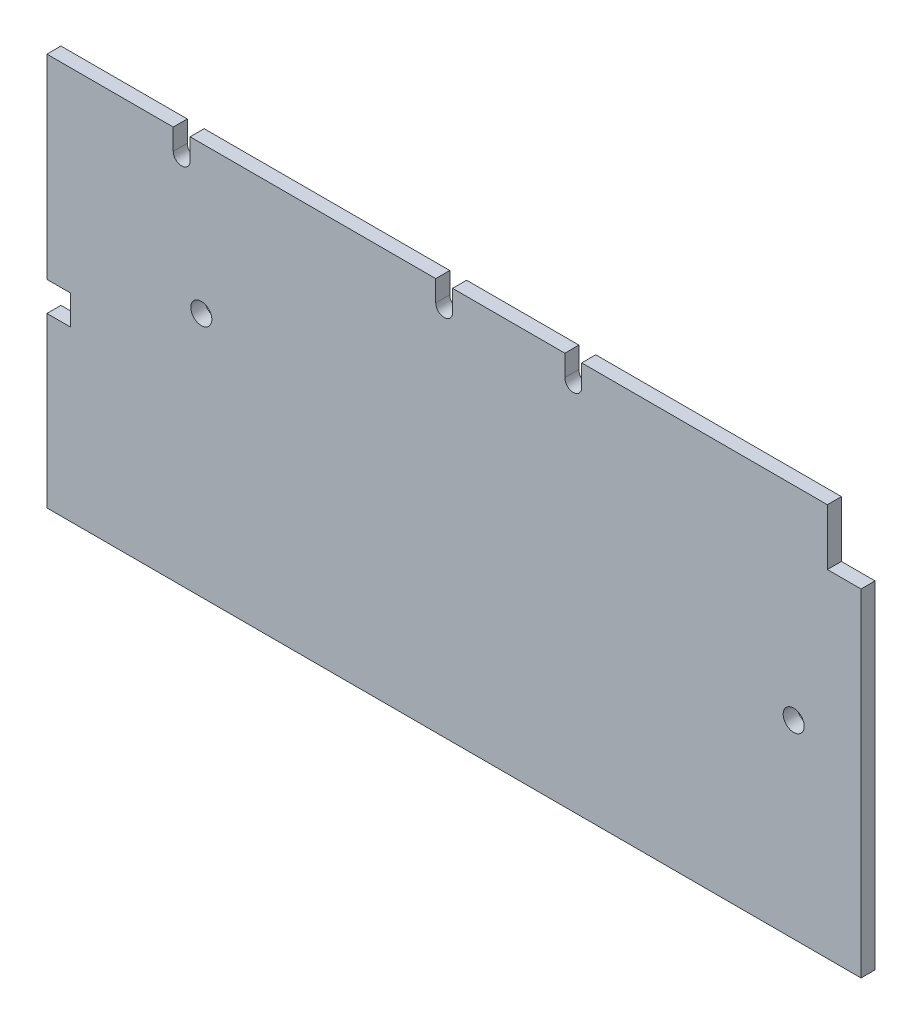
ISO-10303-21;
HEADER;
FILE_DESCRIPTION(('STEP AP214'),'2;1');
FILE_NAME('part.step','',(''),(''),'','','');
FILE_SCHEMA(('AUTOMOTIVE_DESIGN { 1 0 10303 214 1 1 1 1 }'));
ENDSEC;
DATA;
#1=APPLICATION_CONTEXT('core data for automotive mechanical design processes');
#2=APPLICATION_PROTOCOL_DEFINITION('international standard','automotive_design',2000,#1);
#3=PRODUCT_CONTEXT('',#1,'mechanical');
#4=PRODUCT('Part','Part','',(#3));
#5=PRODUCT_RELATED_PRODUCT_CATEGORY('part','',(#4));
#6=PRODUCT_DEFINITION_FORMATION('','',#4);
#7=PRODUCT_DEFINITION_CONTEXT('part definition',#1,'design');
#8=PRODUCT_DEFINITION('design','',#6,#7);
#9=PRODUCT_DEFINITION_SHAPE('','',#8);
#10=(LENGTH_UNIT() NAMED_UNIT(*) SI_UNIT(.MILLI.,.METRE.));
#11=(NAMED_UNIT(*) PLANE_ANGLE_UNIT() SI_UNIT($,.RADIAN.));
#12=(NAMED_UNIT(*) SI_UNIT($,.STERADIAN.) SOLID_ANGLE_UNIT());
#13=UNCERTAINTY_MEASURE_WITH_UNIT(LENGTH_MEASURE(1.E-05),#10,'distance_accuracy_value','');
#14=(GEOMETRIC_REPRESENTATION_CONTEXT(3) GLOBAL_UNCERTAINTY_ASSIGNED_CONTEXT((#13)) GLOBAL_UNIT_ASSIGNED_CONTEXT((#10,
#11,#12)) REPRESENTATION_CONTEXT('',''));
#15=CARTESIAN_POINT('',(0.,0.,0.));
#16=DIRECTION('',(0.,0.,1.));
#17=DIRECTION('',(1.,0.,0.));
#18=AXIS2_PLACEMENT_3D('',#15,#16,#17);
#19=CARTESIAN_POINT('',(14.9531265114608,11.8875176810802,1.));
#20=DIRECTION('',(0.,0.,-1.));
#21=DIRECTION('',(-1.,0.,0.));
#22=AXIS2_PLACEMENT_3D('',#19,#20,#21);
#23=CYLINDRICAL_SURFACE('',#22,0.600461971771314);
#24=CARTESIAN_POINT('',(14.9531265114608,11.8875176810802,0.));
#25=DIRECTION('',(0.,0.,1.));
#26=DIRECTION('',(1.,0.,0.));
#27=AXIS2_PLACEMENT_3D('',#24,#25,#26);
#28=CIRCLE('',#27,0.600461971771314);
#29=CARTESIAN_POINT('',(14.3531265114608,11.9110671936759,0.));
#30=VERTEX_POINT('',#29);
#31=CARTESIAN_POINT('',(15.5531265114608,11.9110671936759,0.));
#32=VERTEX_POINT('',#31);
#33=EDGE_CURVE('E270',#30,#32,#28,.T.);
#34=ORIENTED_EDGE('',*,*,#33,.F.);
#35=DIRECTION('',(0.,0.,-1.));
#36=VECTOR('',#35,1.);
#37=CARTESIAN_POINT('',(14.3531265114608,11.9110671936759,1.));
#38=LINE('',#37,#36);
#39=CARTESIAN_POINT('',(14.3531265114608,11.9110671936759,1.));
#40=VERTEX_POINT('',#39);
#41=EDGE_CURVE('E11',#40,#30,#38,.T.);
#42=ORIENTED_EDGE('',*,*,#41,.F.);
#43=CARTESIAN_POINT('',(14.9531265114608,11.8875176810802,1.));
#44=DIRECTION('',(0.,0.,1.));
#45=DIRECTION('',(1.,0.,0.));
#46=AXIS2_PLACEMENT_3D('',#43,#44,#45);
#47=CIRCLE('',#46,0.600461971771314);
#48=CARTESIAN_POINT('',(15.5531265114608,11.9110671936759,1.));
#49=VERTEX_POINT('',#48);
#50=EDGE_CURVE('E227',#40,#49,#47,.T.);
#51=ORIENTED_EDGE('',*,*,#50,.T.);
#52=DIRECTION('',(0.,0.,-1.));
#53=VECTOR('',#52,1.);
#54=CARTESIAN_POINT('',(15.5531265114608,11.9110671936759,1.));
#55=LINE('',#54,#53);
#56=EDGE_CURVE('E129',#49,#32,#55,.T.);
#57=ORIENTED_EDGE('',*,*,#56,.T.);
#58=EDGE_LOOP('',(#34,#42,#51,#57));
#59=FACE_BOUND('',#58,.T.);
#60=ADVANCED_FACE('F36',(#59),#23,.F.);
#61=CARTESIAN_POINT('',(14.3531265114608,0.,1.));
#62=DIRECTION('',(1.,0.,0.));
#63=DIRECTION('',(0.,0.,-1.));
#64=AXIS2_PLACEMENT_3D('',#61,#62,#63);
#65=PLANE('',#64);
#66=DIRECTION('',(0.,-1.,0.));
#67=VECTOR('',#66,1.);
#68=CARTESIAN_POINT('',(14.3531265114608,0.,0.));
#69=LINE('',#68,#67);
#70=CARTESIAN_POINT('',(14.3531265114608,13.4110671936759,0.));
#71=VERTEX_POINT('',#70);
#72=EDGE_CURVE('E273',#71,#30,#69,.T.);
#73=ORIENTED_EDGE('',*,*,#72,.F.);
#74=DIRECTION('',(0.,0.,-1.));
#75=VECTOR('',#74,1.);
#76=CARTESIAN_POINT('',(14.3531265114608,13.4110671936759,1.));
#77=LINE('',#76,#75);
#78=CARTESIAN_POINT('',(14.3531265114608,13.4110671936759,1.));
#79=VERTEX_POINT('',#78);
#80=EDGE_CURVE('E45',#79,#71,#77,.T.);
#81=ORIENTED_EDGE('',*,*,#80,.F.);
#82=DIRECTION('',(0.,-1.,0.));
#83=VECTOR('',#82,1.);
#84=CARTESIAN_POINT('',(14.3531265114608,0.,1.));
#85=LINE('',#84,#83);
#86=EDGE_CURVE('E222',#79,#40,#85,.T.);
#87=ORIENTED_EDGE('',*,*,#86,.T.);
#88=ORIENTED_EDGE('',*,*,#41,.T.);
#89=EDGE_LOOP('',(#73,#81,#87,#88));
#90=FACE_BOUND('',#89,.T.);
#91=ADVANCED_FACE('F370',(#90),#65,.T.);
#92=CARTESIAN_POINT('',(0.,13.4110671936759,1.));
#93=DIRECTION('',(0.,1.,0.));
#94=DIRECTION('',(0.,0.,1.));
#95=AXIS2_PLACEMENT_3D('',#92,#93,#94);
#96=PLANE('',#95);
#97=DIRECTION('',(1.,0.,0.));
#98=VECTOR('',#97,1.);
#99=CARTESIAN_POINT('',(0.,13.4110671936759,0.));
#100=LINE('',#99,#98);
#101=CARTESIAN_POINT('',(6.35312651146076,13.4110671936759,0.));
#102=VERTEX_POINT('',#101);
#103=EDGE_CURVE('E276',#102,#71,#100,.T.);
#104=ORIENTED_EDGE('',*,*,#103,.F.);
#105=DIRECTION('',(0.,0.,-1.));
#106=VECTOR('',#105,1.);
#107=CARTESIAN_POINT('',(6.35312651146076,13.4110671936759,1.));
#108=LINE('',#107,#106);
#109=CARTESIAN_POINT('',(6.35312651146076,13.4110671936759,1.));
#110=VERTEX_POINT('',#109);
#111=EDGE_CURVE('E364',#110,#102,#108,.T.);
#112=ORIENTED_EDGE('',*,*,#111,.F.);
#113=DIRECTION('',(1.,0.,0.));
#114=VECTOR('',#113,1.);
#115=CARTESIAN_POINT('',(0.,13.4110671936759,1.));
#116=LINE('',#115,#114);
#117=EDGE_CURVE('E212',#110,#79,#116,.T.);
#118=ORIENTED_EDGE('',*,*,#117,.T.);
#119=ORIENTED_EDGE('',*,*,#80,.T.);
#120=EDGE_LOOP('',(#104,#112,#118,#119));
#121=FACE_BOUND('',#120,.T.);
#122=ADVANCED_FACE('F367',(#121),#96,.T.);
#123=CARTESIAN_POINT('',(6.35312651146076,0.,1.));
#124=DIRECTION('',(1.,0.,0.));
#125=DIRECTION('',(0.,0.,-1.));
#126=AXIS2_PLACEMENT_3D('',#123,#124,#125);
#127=PLANE('',#126);
#128=DIRECTION('',(0.,-1.,0.));
#129=VECTOR('',#128,1.);
#130=CARTESIAN_POINT('',(6.35312651146076,0.,0.));
#131=LINE('',#130,#129);
#132=CARTESIAN_POINT('',(6.35312651146076,11.9110671936759,0.));
#133=VERTEX_POINT('',#132);
#134=EDGE_CURVE('E279',#102,#133,#131,.T.);
#135=ORIENTED_EDGE('',*,*,#134,.T.);
#136=DIRECTION('',(0.,0.,-1.));
#137=VECTOR('',#136,1.);
#138=CARTESIAN_POINT('',(6.35312651146076,11.9110671936759,1.));
#139=LINE('',#138,#137);
#140=CARTESIAN_POINT('',(6.35312651146076,11.9110671936759,1.));
#141=VERTEX_POINT('',#140);
#142=EDGE_CURVE('E362',#141,#133,#139,.T.);
#143=ORIENTED_EDGE('',*,*,#142,.F.);
#144=DIRECTION('',(0.,-1.,0.));
#145=VECTOR('',#144,1.);
#146=CARTESIAN_POINT('',(6.35312651146076,0.,1.));
#147=LINE('',#146,#145);
#148=EDGE_CURVE('E221',#110,#141,#147,.T.);
#149=ORIENTED_EDGE('',*,*,#148,.F.);
#150=ORIENTED_EDGE('',*,*,#111,.T.);
#151=EDGE_LOOP('',(#135,#143,#149,#150));
#152=FACE_BOUND('',#151,.T.);
#153=ADVANCED_FACE('F377',(#152),#127,.F.);
#154=CARTESIAN_POINT('',(5.75312651146076,11.9110671936759,1.));
#155=DIRECTION('',(0.,0.,-1.));
#156=DIRECTION('',(-1.,0.,0.));
#157=AXIS2_PLACEMENT_3D('',#154,#155,#156);
#158=CYLINDRICAL_SURFACE('',#157,0.6);
#159=CARTESIAN_POINT('',(5.75312651146076,11.9110671936759,0.));
#160=DIRECTION('',(0.,0.,1.));
#161=DIRECTION('',(1.,0.,0.));
#162=AXIS2_PLACEMENT_3D('',#159,#160,#161);
#163=CIRCLE('',#162,0.6);
#164=CARTESIAN_POINT('',(5.15312651146076,11.9110671936759,0.));
#165=VERTEX_POINT('',#164);
#166=EDGE_CURVE('E284',#165,#133,#163,.T.);
#167=ORIENTED_EDGE('',*,*,#166,.F.);
#168=DIRECTION('',(0.,0.,-1.));
#169=VECTOR('',#168,1.);
#170=CARTESIAN_POINT('',(5.15312651146076,11.9110671936759,1.));
#171=LINE('',#170,#169);
#172=CARTESIAN_POINT('',(5.15312651146076,11.9110671936759,1.));
#173=VERTEX_POINT('',#172);
#174=EDGE_CURVE('E360',#173,#165,#171,.T.);
#175=ORIENTED_EDGE('',*,*,#174,.F.);
#176=CARTESIAN_POINT('',(5.75312651146076,11.9110671936759,1.));
#177=DIRECTION('',(0.,0.,1.));
#178=DIRECTION('',(1.,0.,0.));
#179=AXIS2_PLACEMENT_3D('',#176,#177,#178);
#180=CIRCLE('',#179,0.6);
#181=EDGE_CURVE('E225',#173,#141,#180,.T.);
#182=ORIENTED_EDGE('',*,*,#181,.T.);
#183=ORIENTED_EDGE('',*,*,#142,.T.);
#184=EDGE_LOOP('',(#167,#175,#182,#183));
#185=FACE_BOUND('',#184,.T.);
#186=ADVANCED_FACE('F416',(#185),#158,.F.);
#187=CARTESIAN_POINT('',(5.15312651146076,0.,1.));
#188=DIRECTION('',(1.,0.,0.));
#189=DIRECTION('',(0.,1.,0.));
#190=AXIS2_PLACEMENT_3D('',#187,#188,#189);
#191=PLANE('',#190);
#192=DIRECTION('',(0.,-1.,0.));
#193=VECTOR('',#192,1.);
#194=CARTESIAN_POINT('',(5.15312651146076,0.,0.));
#195=LINE('',#194,#193);
#196=CARTESIAN_POINT('',(5.15312651146076,13.4110671936759,0.));
#197=VERTEX_POINT('',#196);
#198=EDGE_CURVE('E287',#197,#165,#195,.T.);
#199=ORIENTED_EDGE('',*,*,#198,.F.);
#200=DIRECTION('',(0.,0.,-1.));
#201=VECTOR('',#200,1.);
#202=CARTESIAN_POINT('',(5.15312651146076,13.4110671936759,1.));
#203=LINE('',#202,#201);
#204=CARTESIAN_POINT('',(5.15312651146076,13.4110671936759,1.));
#205=VERTEX_POINT('',#204);
#206=EDGE_CURVE('E358',#205,#197,#203,.T.);
#207=ORIENTED_EDGE('',*,*,#206,.F.);
#208=DIRECTION('',(0.,-1.,0.));
#209=VECTOR('',#208,1.);
#210=CARTESIAN_POINT('',(5.15312651146076,0.,1.));
#211=LINE('',#210,#209);
#212=EDGE_CURVE('E230',#205,#173,#211,.T.);
#213=ORIENTED_EDGE('',*,*,#212,.T.);
#214=ORIENTED_EDGE('',*,*,#174,.T.);
#215=EDGE_LOOP('',(#199,#207,#213,#214));
#216=FACE_BOUND('',#215,.T.);
#217=ADVANCED_FACE('F419',(#216),#191,.T.);
#218=CARTESIAN_POINT('',(-12.3468734885392,13.4110671936759,0.));
#219=VERTEX_POINT('',#218);
#220=EDGE_CURVE('E281',#219,#197,#100,.T.);
#221=ORIENTED_EDGE('',*,*,#220,.F.);
#222=DIRECTION('',(0.,0.,-1.));
#223=VECTOR('',#222,1.);
#224=CARTESIAN_POINT('',(-12.3468734885392,13.4110671936759,1.));
#225=LINE('',#224,#223);
#226=CARTESIAN_POINT('',(-12.3468734885392,13.4110671936759,1.));
#227=VERTEX_POINT('',#226);
#228=EDGE_CURVE('E356',#227,#219,#225,.T.);
#229=ORIENTED_EDGE('',*,*,#228,.F.);
#230=EDGE_CURVE('E219',#227,#205,#116,.T.);
#231=ORIENTED_EDGE('',*,*,#230,.T.);
#232=ORIENTED_EDGE('',*,*,#206,.T.);
#233=EDGE_LOOP('',(#221,#229,#231,#232));
#234=FACE_BOUND('',#233,.T.);
#235=ADVANCED_FACE('F423',(#234),#96,.T.);
#236=CARTESIAN_POINT('',(-12.3468734885392,0.,1.));
#237=DIRECTION('',(1.,0.,0.));
#238=DIRECTION('',(0.,0.,-1.));
#239=AXIS2_PLACEMENT_3D('',#236,#237,#238);
#240=PLANE('',#239);
#241=DIRECTION('',(0.,-1.,0.));
#242=VECTOR('',#241,1.);
#243=CARTESIAN_POINT('',(-12.3468734885392,0.,0.));
#244=LINE('',#243,#242);
#245=CARTESIAN_POINT('',(-12.3468734885392,11.9110671936759,0.));
#246=VERTEX_POINT('',#245);
#247=EDGE_CURVE('E290',#219,#246,#244,.T.);
#248=ORIENTED_EDGE('',*,*,#247,.T.);
#249=DIRECTION('',(0.,0.,-1.));
#250=VECTOR('',#249,1.);
#251=CARTESIAN_POINT('',(-12.3468734885392,11.9110671936759,1.));
#252=LINE('',#251,#250);
#253=CARTESIAN_POINT('',(-12.3468734885392,11.9110671936759,1.));
#254=VERTEX_POINT('',#253);
#255=EDGE_CURVE('E354',#254,#246,#252,.T.);
#256=ORIENTED_EDGE('',*,*,#255,.F.);
#257=DIRECTION('',(0.,-1.,0.));
#258=VECTOR('',#257,1.);
#259=CARTESIAN_POINT('',(-12.3468734885392,0.,1.));
#260=LINE('',#259,#258);
#261=EDGE_CURVE('E229',#227,#254,#260,.T.);
#262=ORIENTED_EDGE('',*,*,#261,.F.);
#263=ORIENTED_EDGE('',*,*,#228,.T.);
#264=EDGE_LOOP('',(#248,#256,#262,#263));
#265=FACE_BOUND('',#264,.T.);
#266=ADVANCED_FACE('F424',(#265),#240,.F.);
#267=CARTESIAN_POINT('',(-12.9468734885392,11.9110671936759,1.));
#268=DIRECTION('',(0.,0.,-1.));
#269=DIRECTION('',(-1.,0.,0.));
#270=AXIS2_PLACEMENT_3D('',#267,#268,#269);
#271=CYLINDRICAL_SURFACE('',#270,0.6);
#272=CARTESIAN_POINT('',(-12.9468734885392,11.9110671936759,0.));
#273=DIRECTION('',(0.,0.,1.));
#274=DIRECTION('',(1.,0.,0.));
#275=AXIS2_PLACEMENT_3D('',#272,#273,#274);
#276=CIRCLE('',#275,0.6);
#277=CARTESIAN_POINT('',(-13.5468734885392,11.9110671936759,0.));
#278=VERTEX_POINT('',#277);
#279=EDGE_CURVE('E293',#278,#246,#276,.T.);
#280=ORIENTED_EDGE('',*,*,#279,.F.);
#281=DIRECTION('',(0.,0.,-1.));
#282=VECTOR('',#281,1.);
#283=CARTESIAN_POINT('',(-13.5468734885392,11.9110671936759,1.));
#284=LINE('',#283,#282);
#285=CARTESIAN_POINT('',(-13.5468734885392,11.9110671936759,1.));
#286=VERTEX_POINT('',#285);
#287=EDGE_CURVE('E352',#286,#278,#284,.T.);
#288=ORIENTED_EDGE('',*,*,#287,.F.);
#289=CARTESIAN_POINT('',(-12.9468734885392,11.9110671936759,1.));
#290=DIRECTION('',(0.,0.,1.));
#291=DIRECTION('',(1.,0.,0.));
#292=AXIS2_PLACEMENT_3D('',#289,#290,#291);
#293=CIRCLE('',#292,0.6);
#294=EDGE_CURVE('E233',#286,#254,#293,.T.);
#295=ORIENTED_EDGE('',*,*,#294,.T.);
#296=ORIENTED_EDGE('',*,*,#255,.T.);
#297=EDGE_LOOP('',(#280,#288,#295,#296));
#298=FACE_BOUND('',#297,.T.);
#299=ADVANCED_FACE('F427',(#298),#271,.F.);
#300=CARTESIAN_POINT('',(-13.5468734885392,0.,1.));
#301=DIRECTION('',(1.,0.,0.));
#302=DIRECTION('',(0.,0.,-1.));
#303=AXIS2_PLACEMENT_3D('',#300,#301,#302);
#304=PLANE('',#303);
#305=DIRECTION('',(0.,-1.,0.));
#306=VECTOR('',#305,1.);
#307=CARTESIAN_POINT('',(-13.5468734885392,0.,0.));
#308=LINE('',#307,#306);
#309=CARTESIAN_POINT('',(-13.5468734885392,13.4110671936759,0.));
#310=VERTEX_POINT('',#309);
#311=EDGE_CURVE('E296',#310,#278,#308,.T.);
#312=ORIENTED_EDGE('',*,*,#311,.F.);
#313=DIRECTION('',(0.,0.,-1.));
#314=VECTOR('',#313,1.);
#315=CARTESIAN_POINT('',(-13.5468734885392,13.4110671936759,1.));
#316=LINE('',#315,#314);
#317=CARTESIAN_POINT('',(-13.5468734885392,13.4110671936759,1.));
#318=VERTEX_POINT('',#317);
#319=EDGE_CURVE('E350',#318,#310,#316,.T.);
#320=ORIENTED_EDGE('',*,*,#319,.F.);
#321=DIRECTION('',(0.,-1.,0.));
#322=VECTOR('',#321,1.);
#323=CARTESIAN_POINT('',(-13.5468734885392,0.,1.));
#324=LINE('',#323,#322);
#325=EDGE_CURVE('E218',#318,#286,#324,.T.);
#326=ORIENTED_EDGE('',*,*,#325,.T.);
#327=ORIENTED_EDGE('',*,*,#287,.T.);
#328=EDGE_LOOP('',(#312,#320,#326,#327));
#329=FACE_BOUND('',#328,.T.);
#330=ADVANCED_FACE('F431',(#329),#304,.T.);
#331=CARTESIAN_POINT('',(-22.5468734885392,13.4110671936759,0.));
#332=VERTEX_POINT('',#331);
#333=EDGE_CURVE('E299',#332,#310,#100,.T.);
#334=ORIENTED_EDGE('',*,*,#333,.F.);
#335=DIRECTION('',(0.,0.,-1.));
#336=VECTOR('',#335,1.);
#337=CARTESIAN_POINT('',(-22.5468734885392,13.4110671936759,1.));
#338=LINE('',#337,#336);
#339=CARTESIAN_POINT('',(-22.5468734885392,13.4110671936759,1.));
#340=VERTEX_POINT('',#339);
#341=EDGE_CURVE('E348',#340,#332,#338,.T.);
#342=ORIENTED_EDGE('',*,*,#341,.F.);
#343=EDGE_CURVE('E211',#340,#318,#116,.T.);
#344=ORIENTED_EDGE('',*,*,#343,.T.);
#345=ORIENTED_EDGE('',*,*,#319,.T.);
#346=EDGE_LOOP('',(#334,#342,#344,#345));
#347=FACE_BOUND('',#346,.T.);
#348=ADVANCED_FACE('F435',(#347),#96,.T.);
#349=CARTESIAN_POINT('',(-22.5468734885392,0.,1.));
#350=DIRECTION('',(1.,0.,0.));
#351=DIRECTION('',(0.,1.,0.));
#352=AXIS2_PLACEMENT_3D('',#349,#350,#351);
#353=PLANE('',#352);
#354=DIRECTION('',(0.,-1.,0.));
#355=VECTOR('',#354,1.);
#356=CARTESIAN_POINT('',(-22.5468734885392,0.,0.));
#357=LINE('',#356,#355);
#358=CARTESIAN_POINT('',(-22.5468734885392,-0.488932806324107,0.));
#359=VERTEX_POINT('',#358);
#360=EDGE_CURVE('E300',#332,#359,#357,.T.);
#361=ORIENTED_EDGE('',*,*,#360,.T.);
#362=DIRECTION('',(0.,0.,-1.));
#363=VECTOR('',#362,1.);
#364=CARTESIAN_POINT('',(-22.5468734885392,-0.488932806324107,1.));
#365=LINE('',#364,#363);
#366=CARTESIAN_POINT('',(-22.5468734885392,-0.488932806324107,1.));
#367=VERTEX_POINT('',#366);
#368=EDGE_CURVE('E345',#367,#359,#365,.T.);
#369=ORIENTED_EDGE('',*,*,#368,.F.);
#370=DIRECTION('',(0.,-1.,0.));
#371=VECTOR('',#370,1.);
#372=CARTESIAN_POINT('',(-22.5468734885392,0.,1.));
#373=LINE('',#372,#371);
#374=EDGE_CURVE('E217',#340,#367,#373,.T.);
#375=ORIENTED_EDGE('',*,*,#374,.F.);
#376=ORIENTED_EDGE('',*,*,#341,.T.);
#377=EDGE_LOOP('',(#361,#369,#375,#376));
#378=FACE_BOUND('',#377,.T.);
#379=ADVANCED_FACE('F441',(#378),#353,.F.);
#380=CARTESIAN_POINT('',(0.,-0.488932806324107,1.));
#381=DIRECTION('',(0.,1.,0.));
#382=DIRECTION('',(0.,0.,1.));
#383=AXIS2_PLACEMENT_3D('',#380,#381,#382);
#384=PLANE('',#383);
#385=DIRECTION('',(1.,0.,0.));
#386=VECTOR('',#385,1.);
#387=CARTESIAN_POINT('',(0.,-0.488932806324107,0.));
#388=LINE('',#387,#386);
#389=CARTESIAN_POINT('',(-20.8831193480634,-0.488932806324107,0.));
#390=VERTEX_POINT('',#389);
#391=EDGE_CURVE('E303',#359,#390,#388,.T.);
#392=ORIENTED_EDGE('',*,*,#391,.T.);
#393=DIRECTION('',(0.,0.,-1.));
#394=VECTOR('',#393,1.);
#395=CARTESIAN_POINT('',(-20.8831193480634,-0.488932806324107,1.));
#396=LINE('',#395,#394);
#397=CARTESIAN_POINT('',(-20.8831193480634,-0.488932806324107,1.));
#398=VERTEX_POINT('',#397);
#399=EDGE_CURVE('E342',#398,#390,#396,.T.);
#400=ORIENTED_EDGE('',*,*,#399,.F.);
#401=DIRECTION('',(1.,0.,0.));
#402=VECTOR('',#401,1.);
#403=CARTESIAN_POINT('',(0.,-0.488932806324107,1.));
#404=LINE('',#403,#402);
#405=EDGE_CURVE('E248',#367,#398,#404,.T.);
#406=ORIENTED_EDGE('',*,*,#405,.F.);
#407=ORIENTED_EDGE('',*,*,#368,.T.);
#408=EDGE_LOOP('',(#392,#400,#406,#407));
#409=FACE_BOUND('',#408,.T.);
#410=ADVANCED_FACE('F437',(#409),#384,.F.);
#411=CARTESIAN_POINT('',(-20.8831193480634,0.,1.));
#412=DIRECTION('',(1.,0.,0.));
#413=DIRECTION('',(0.,0.,-1.));
#414=AXIS2_PLACEMENT_3D('',#411,#412,#413);
#415=PLANE('',#414);
#416=DIRECTION('',(0.,-1.,0.));
#417=VECTOR('',#416,1.);
#418=CARTESIAN_POINT('',(-20.8831193480634,0.,0.));
#419=LINE('',#418,#417);
#420=CARTESIAN_POINT('',(-20.8831193480634,-2.58893280632411,0.));
#421=VERTEX_POINT('',#420);
#422=EDGE_CURVE('E307',#390,#421,#419,.T.);
#423=ORIENTED_EDGE('',*,*,#422,.T.);
#424=DIRECTION('',(0.,0.,-1.));
#425=VECTOR('',#424,1.);
#426=CARTESIAN_POINT('',(-20.8831193480634,-2.58893280632411,1.));
#427=LINE('',#426,#425);
#428=CARTESIAN_POINT('',(-20.8831193480634,-2.58893280632411,1.));
#429=VERTEX_POINT('',#428);
#430=EDGE_CURVE('E339',#429,#421,#427,.T.);
#431=ORIENTED_EDGE('',*,*,#430,.F.);
#432=DIRECTION('',(0.,-1.,0.));
#433=VECTOR('',#432,1.);
#434=CARTESIAN_POINT('',(-20.8831193480634,0.,1.));
#435=LINE('',#434,#433);
#436=EDGE_CURVE('E252',#398,#429,#435,.T.);
#437=ORIENTED_EDGE('',*,*,#436,.F.);
#438=ORIENTED_EDGE('',*,*,#399,.T.);
#439=EDGE_LOOP('',(#423,#431,#437,#438));
#440=FACE_BOUND('',#439,.T.);
#441=ADVANCED_FACE('F440',(#440),#415,.F.);
#442=CARTESIAN_POINT('',(0.,-2.58893280632411,1.));
#443=DIRECTION('',(0.,-1.,0.));
#444=DIRECTION('',(0.,0.,-1.));
#445=AXIS2_PLACEMENT_3D('',#442,#443,#444);
#446=PLANE('',#445);
#447=DIRECTION('',(-1.,0.,0.));
#448=VECTOR('',#447,1.);
#449=CARTESIAN_POINT('',(0.,-2.58893280632411,0.));
#450=LINE('',#449,#448);
#451=CARTESIAN_POINT('',(-22.5468734885392,-2.58893280632411,0.));
#452=VERTEX_POINT('',#451);
#453=EDGE_CURVE('E310',#421,#452,#450,.T.);
#454=ORIENTED_EDGE('',*,*,#453,.T.);
#455=DIRECTION('',(0.,0.,-1.));
#456=VECTOR('',#455,1.);
#457=CARTESIAN_POINT('',(-22.5468734885392,-2.58893280632411,1.));
#458=LINE('',#457,#456);
#459=CARTESIAN_POINT('',(-22.5468734885392,-2.58893280632411,1.));
#460=VERTEX_POINT('',#459);
#461=EDGE_CURVE('E336',#460,#452,#458,.T.);
#462=ORIENTED_EDGE('',*,*,#461,.F.);
#463=DIRECTION('',(-1.,0.,0.));
#464=VECTOR('',#463,1.);
#465=CARTESIAN_POINT('',(0.,-2.58893280632411,1.));
#466=LINE('',#465,#464);
#467=EDGE_CURVE('E255',#429,#460,#466,.T.);
#468=ORIENTED_EDGE('',*,*,#467,.F.);
#469=ORIENTED_EDGE('',*,*,#430,.T.);
#470=EDGE_LOOP('',(#454,#462,#468,#469));
#471=FACE_BOUND('',#470,.T.);
#472=ADVANCED_FACE('F445',(#471),#446,.F.);
#473=CARTESIAN_POINT('',(-22.5468734885392,-14.5889328063241,0.));
#474=VERTEX_POINT('',#473);
#475=EDGE_CURVE('E304',#452,#474,#357,.T.);
#476=ORIENTED_EDGE('',*,*,#475,.T.);
#477=DIRECTION('',(0.,0.,-1.));
#478=VECTOR('',#477,1.);
#479=CARTESIAN_POINT('',(-22.5468734885392,-14.5889328063241,1.));
#480=LINE('',#479,#478);
#481=CARTESIAN_POINT('',(-22.5468734885392,-14.5889328063241,1.));
#482=VERTEX_POINT('',#481);
#483=EDGE_CURVE('E333',#482,#474,#480,.T.);
#484=ORIENTED_EDGE('',*,*,#483,.F.);
#485=EDGE_CURVE('E249',#460,#482,#373,.T.);
#486=ORIENTED_EDGE('',*,*,#485,.F.);
#487=ORIENTED_EDGE('',*,*,#461,.T.);
#488=EDGE_LOOP('',(#476,#484,#486,#487));
#489=FACE_BOUND('',#488,.T.);
#490=ADVANCED_FACE('F449',(#489),#353,.F.);
#491=CARTESIAN_POINT('',(0.,-14.5889328063241,1.));
#492=DIRECTION('',(0.,1.,0.));
#493=DIRECTION('',(0.,0.,1.));
#494=AXIS2_PLACEMENT_3D('',#491,#492,#493);
#495=PLANE('',#494);
#496=DIRECTION('',(1.,0.,0.));
#497=VECTOR('',#496,1.);
#498=CARTESIAN_POINT('',(0.,-14.5889328063241,0.));
#499=LINE('',#498,#497);
#500=CARTESIAN_POINT('',(35.4531265114608,-14.5889328063241,0.));
#501=VERTEX_POINT('',#500);
#502=EDGE_CURVE('E313',#474,#501,#499,.T.);
#503=ORIENTED_EDGE('',*,*,#502,.T.);
#504=DIRECTION('',(0.,0.,-1.));
#505=VECTOR('',#504,1.);
#506=CARTESIAN_POINT('',(35.4531265114608,-14.5889328063241,1.));
#507=LINE('',#506,#505);
#508=CARTESIAN_POINT('',(35.4531265114608,-14.5889328063241,1.));
#509=VERTEX_POINT('',#508);
#510=EDGE_CURVE('E331',#509,#501,#507,.T.);
#511=ORIENTED_EDGE('',*,*,#510,.F.);
#512=DIRECTION('',(1.,0.,0.));
#513=VECTOR('',#512,1.);
#514=CARTESIAN_POINT('',(0.,-14.5889328063241,1.));
#515=LINE('',#514,#513);
#516=EDGE_CURVE('E258',#482,#509,#515,.T.);
#517=ORIENTED_EDGE('',*,*,#516,.F.);
#518=ORIENTED_EDGE('',*,*,#483,.T.);
#519=EDGE_LOOP('',(#503,#511,#517,#518));
#520=FACE_BOUND('',#519,.T.);
#521=ADVANCED_FACE('F453',(#520),#495,.F.);
#522=CARTESIAN_POINT('',(35.4531265114608,0.,1.));
#523=DIRECTION('',(1.,0.,0.));
#524=DIRECTION('',(0.,0.,-1.));
#525=AXIS2_PLACEMENT_3D('',#522,#523,#524);
#526=PLANE('',#525);
#527=DIRECTION('',(0.,-1.,0.));
#528=VECTOR('',#527,1.);
#529=CARTESIAN_POINT('',(35.4531265114608,0.,0.));
#530=LINE('',#529,#528);
#531=CARTESIAN_POINT('',(35.4531265114608,9.41106719367589,0.));
#532=VERTEX_POINT('',#531);
#533=EDGE_CURVE('E316',#532,#501,#530,.T.);
#534=ORIENTED_EDGE('',*,*,#533,.F.);
#535=DIRECTION('',(0.,0.,-1.));
#536=VECTOR('',#535,1.);
#537=CARTESIAN_POINT('',(35.4531265114608,9.41106719367589,1.));
#538=LINE('',#537,#536);
#539=CARTESIAN_POINT('',(35.4531265114608,9.41106719367589,1.));
#540=VERTEX_POINT('',#539);
#541=EDGE_CURVE('E329',#540,#532,#538,.T.);
#542=ORIENTED_EDGE('',*,*,#541,.F.);
#543=DIRECTION('',(0.,-1.,0.));
#544=VECTOR('',#543,1.);
#545=CARTESIAN_POINT('',(35.4531265114608,0.,1.));
#546=LINE('',#545,#544);
#547=EDGE_CURVE('E260',#540,#509,#546,.T.);
#548=ORIENTED_EDGE('',*,*,#547,.T.);
#549=ORIENTED_EDGE('',*,*,#510,.T.);
#550=EDGE_LOOP('',(#534,#542,#548,#549));
#551=FACE_BOUND('',#550,.T.);
#552=ADVANCED_FACE('F457',(#551),#526,.T.);
#553=CARTESIAN_POINT('',(0.,9.41106719367589,1.));
#554=DIRECTION('',(0.,1.,0.));
#555=DIRECTION('',(0.,0.,1.));
#556=AXIS2_PLACEMENT_3D('',#553,#554,#555);
#557=PLANE('',#556);
#558=DIRECTION('',(1.,0.,0.));
#559=VECTOR('',#558,1.);
#560=CARTESIAN_POINT('',(0.,9.41106719367589,0.));
#561=LINE('',#560,#559);
#562=CARTESIAN_POINT('',(33.0531265114608,9.41106719367589,0.));
#563=VERTEX_POINT('',#562);
#564=EDGE_CURVE('E319',#563,#532,#561,.T.);
#565=ORIENTED_EDGE('',*,*,#564,.F.);
#566=DIRECTION('',(0.,0.,-1.));
#567=VECTOR('',#566,1.);
#568=CARTESIAN_POINT('',(33.0531265114608,9.41106719367589,1.));
#569=LINE('',#568,#567);
#570=CARTESIAN_POINT('',(33.0531265114608,9.41106719367589,1.));
#571=VERTEX_POINT('',#570);
#572=EDGE_CURVE('E200',#571,#563,#569,.T.);
#573=ORIENTED_EDGE('',*,*,#572,.F.);
#574=DIRECTION('',(1.,0.,0.));
#575=VECTOR('',#574,1.);
#576=CARTESIAN_POINT('',(0.,9.41106719367589,1.));
#577=LINE('',#576,#575);
#578=EDGE_CURVE('E207',#571,#540,#577,.T.);
#579=ORIENTED_EDGE('',*,*,#578,.T.);
#580=ORIENTED_EDGE('',*,*,#541,.T.);
#581=EDGE_LOOP('',(#565,#573,#579,#580));
#582=FACE_BOUND('',#581,.T.);
#583=ADVANCED_FACE('F461',(#582),#557,.T.);
#584=CARTESIAN_POINT('',(33.0531265114608,0.,1.));
#585=DIRECTION('',(1.,0.,0.));
#586=DIRECTION('',(0.,0.,-1.));
#587=AXIS2_PLACEMENT_3D('',#584,#585,#586);
#588=PLANE('',#587);
#589=DIRECTION('',(0.,-1.,0.));
#590=VECTOR('',#589,1.);
#591=CARTESIAN_POINT('',(33.0531265114608,0.,0.));
#592=LINE('',#591,#590);
#593=CARTESIAN_POINT('',(33.0531265114608,13.4110671936759,0.));
#594=VERTEX_POINT('',#593);
#595=EDGE_CURVE('E195',#594,#563,#592,.T.);
#596=ORIENTED_EDGE('',*,*,#595,.F.);
#597=DIRECTION('',(0.,0.,-1.));
#598=VECTOR('',#597,1.);
#599=CARTESIAN_POINT('',(33.0531265114608,13.4110671936759,1.));
#600=LINE('',#599,#598);
#601=CARTESIAN_POINT('',(33.0531265114608,13.4110671936759,1.));
#602=VERTEX_POINT('',#601);
#603=EDGE_CURVE('E190',#602,#594,#600,.T.);
#604=ORIENTED_EDGE('',*,*,#603,.F.);
#605=DIRECTION('',(0.,-1.,0.));
#606=VECTOR('',#605,1.);
#607=CARTESIAN_POINT('',(33.0531265114608,0.,1.));
#608=LINE('',#607,#606);
#609=EDGE_CURVE('E193',#602,#571,#608,.T.);
#610=ORIENTED_EDGE('',*,*,#609,.T.);
#611=ORIENTED_EDGE('',*,*,#572,.T.);
#612=EDGE_LOOP('',(#596,#604,#610,#611));
#613=FACE_BOUND('',#612,.T.);
#614=ADVANCED_FACE('F192',(#613),#588,.T.);
#615=CARTESIAN_POINT('',(15.5531265114608,13.4110671936759,0.));
#616=VERTEX_POINT('',#615);
#617=EDGE_CURVE('E280',#616,#594,#100,.T.);
#618=ORIENTED_EDGE('',*,*,#617,.F.);
#619=DIRECTION('',(0.,0.,-1.));
#620=VECTOR('',#619,1.);
#621=CARTESIAN_POINT('',(15.5531265114608,13.4110671936759,1.));
#622=LINE('',#621,#620);
#623=CARTESIAN_POINT('',(15.5531265114608,13.4110671936759,1.));
#624=VERTEX_POINT('',#623);
#625=EDGE_CURVE('E122',#624,#616,#622,.T.);
#626=ORIENTED_EDGE('',*,*,#625,.F.);
#627=EDGE_CURVE('E204',#624,#602,#116,.T.);
#628=ORIENTED_EDGE('',*,*,#627,.T.);
#629=ORIENTED_EDGE('',*,*,#603,.T.);
#630=EDGE_LOOP('',(#618,#626,#628,#629));
#631=FACE_BOUND('',#630,.T.);
#632=ADVANCED_FACE('F209',(#631),#96,.T.);
#633=CARTESIAN_POINT('',(-11.5468734885392,2.91106719367589,1.));
#634=DIRECTION('',(0.,0.,-1.));
#635=DIRECTION('',(-1.,0.,0.));
#636=AXIS2_PLACEMENT_3D('',#633,#634,#635);
#637=CYLINDRICAL_SURFACE('',#636,0.75);
#638=CARTESIAN_POINT('',(-11.5468734885392,2.91106719367589,1.));
#639=DIRECTION('',(0.,0.,1.));
#640=DIRECTION('',(1.,0.,0.));
#641=AXIS2_PLACEMENT_3D('',#638,#639,#640);
#642=CIRCLE('',#641,0.75);
#643=CARTESIAN_POINT('',(-10.7968734885392,2.91106719367589,1.));
#644=VERTEX_POINT('',#643);
#645=EDGE_CURVE('E380',#644,#644,#642,.T.);
#646=ORIENTED_EDGE('',*,*,#645,.T.);
#647=EDGE_LOOP('',(#646));
#648=FACE_BOUND('',#647,.T.);
#649=CARTESIAN_POINT('',(-11.5468734885392,2.91106719367589,0.));
#650=DIRECTION('',(0.,0.,1.));
#651=DIRECTION('',(1.,0.,0.));
#652=AXIS2_PLACEMENT_3D('',#649,#650,#651);
#653=CIRCLE('',#652,0.75);
#654=CARTESIAN_POINT('',(-10.7968734885392,2.91106719367589,0.));
#655=VERTEX_POINT('',#654);
#656=EDGE_CURVE('E267',#655,#655,#653,.T.);
#657=ORIENTED_EDGE('',*,*,#656,.F.);
#658=EDGE_LOOP('',(#657));
#659=FACE_BOUND('',#658,.T.);
#660=ADVANCED_FACE('F396',(#648,#659),#637,.F.);
#661=CARTESIAN_POINT('',(30.6531265114608,-1.08893280632411,1.));
#662=DIRECTION('',(0.,0.,-1.));
#663=DIRECTION('',(-1.,0.,0.));
#664=AXIS2_PLACEMENT_3D('',#661,#662,#663);
#665=CYLINDRICAL_SURFACE('',#664,0.749999999999995);
#666=CARTESIAN_POINT('',(30.6531265114608,-1.08893280632411,1.));
#667=DIRECTION('',(0.,0.,1.));
#668=DIRECTION('',(1.,0.,0.));
#669=AXIS2_PLACEMENT_3D('',#666,#667,#668);
#670=CIRCLE('',#669,0.749999999999995);
#671=CARTESIAN_POINT('',(31.4031265114608,-1.08893280632411,1.));
#672=VERTEX_POINT('',#671);
#673=EDGE_CURVE('E325',#672,#672,#670,.T.);
#674=ORIENTED_EDGE('',*,*,#673,.T.);
#675=EDGE_LOOP('',(#674));
#676=FACE_BOUND('',#675,.T.);
#677=CARTESIAN_POINT('',(30.6531265114608,-1.08893280632411,0.));
#678=DIRECTION('',(0.,0.,1.));
#679=DIRECTION('',(1.,0.,0.));
#680=AXIS2_PLACEMENT_3D('',#677,#678,#679);
#681=CIRCLE('',#680,0.749999999999995);
#682=CARTESIAN_POINT('',(31.4031265114608,-1.08893280632411,0.));
#683=VERTEX_POINT('',#682);
#684=EDGE_CURVE('E264',#683,#683,#681,.T.);
#685=ORIENTED_EDGE('',*,*,#684,.F.);
#686=EDGE_LOOP('',(#685));
#687=FACE_BOUND('',#686,.T.);
#688=ADVANCED_FACE('F38',(#676,#687),#665,.F.);
#689=CARTESIAN_POINT('',(15.5531265114608,0.,1.));
#690=DIRECTION('',(1.,0.,0.));
#691=DIRECTION('',(0.,0.,-1.));
#692=AXIS2_PLACEMENT_3D('',#689,#690,#691);
#693=PLANE('',#692);
#694=DIRECTION('',(0.,-1.,0.));
#695=VECTOR('',#694,1.);
#696=CARTESIAN_POINT('',(15.5531265114608,0.,0.));
#697=LINE('',#696,#695);
#698=EDGE_CURVE('E323',#616,#32,#697,.T.);
#699=ORIENTED_EDGE('',*,*,#698,.T.);
#700=ORIENTED_EDGE('',*,*,#56,.F.);
#701=DIRECTION('',(0.,-1.,0.));
#702=VECTOR('',#701,1.);
#703=CARTESIAN_POINT('',(15.5531265114608,0.,1.));
#704=LINE('',#703,#702);
#705=EDGE_CURVE('E53',#624,#49,#704,.T.);
#706=ORIENTED_EDGE('',*,*,#705,.F.);
#707=ORIENTED_EDGE('',*,*,#625,.T.);
#708=EDGE_LOOP('',(#699,#700,#706,#707));
#709=FACE_BOUND('',#708,.T.);
#710=ADVANCED_FACE('F392',(#709),#693,.F.);
#711=CARTESIAN_POINT('',(0.,0.,1.));
#712=DIRECTION('',(0.,0.,1.));
#713=DIRECTION('',(1.,0.,0.));
#714=AXIS2_PLACEMENT_3D('',#711,#712,#713);
#715=PLANE('',#714);
#716=ORIENTED_EDGE('',*,*,#673,.F.);
#717=EDGE_LOOP('',(#716));
#718=FACE_BOUND('',#717,.T.);
#719=ORIENTED_EDGE('',*,*,#645,.F.);
#720=EDGE_LOOP('',(#719));
#721=FACE_BOUND('',#720,.T.);
#722=ORIENTED_EDGE('',*,*,#50,.F.);
#723=ORIENTED_EDGE('',*,*,#86,.F.);
#724=ORIENTED_EDGE('',*,*,#117,.F.);
#725=ORIENTED_EDGE('',*,*,#148,.T.);
#726=ORIENTED_EDGE('',*,*,#181,.F.);
#727=ORIENTED_EDGE('',*,*,#212,.F.);
#728=ORIENTED_EDGE('',*,*,#230,.F.);
#729=ORIENTED_EDGE('',*,*,#261,.T.);
#730=ORIENTED_EDGE('',*,*,#294,.F.);
#731=ORIENTED_EDGE('',*,*,#325,.F.);
#732=ORIENTED_EDGE('',*,*,#343,.F.);
#733=ORIENTED_EDGE('',*,*,#374,.T.);
#734=ORIENTED_EDGE('',*,*,#405,.T.);
#735=ORIENTED_EDGE('',*,*,#436,.T.);
#736=ORIENTED_EDGE('',*,*,#467,.T.);
#737=ORIENTED_EDGE('',*,*,#485,.T.);
#738=ORIENTED_EDGE('',*,*,#516,.T.);
#739=ORIENTED_EDGE('',*,*,#547,.F.);
#740=ORIENTED_EDGE('',*,*,#578,.F.);
#741=ORIENTED_EDGE('',*,*,#609,.F.);
#742=ORIENTED_EDGE('',*,*,#627,.F.);
#743=ORIENTED_EDGE('',*,*,#705,.T.);
#744=EDGE_LOOP('',(#722,#723,#724,#725,#726,#727,#728,#729,#730,#731,#732,#733,#734,#735,#736,
#737,#738,#739,#740,#741,#742,#743));
#745=FACE_BOUND('',#744,.T.);
#746=ADVANCED_FACE('F203',(#718,#721,#745),#715,.T.);
#747=CARTESIAN_POINT('',(0.,0.,0.));
#748=DIRECTION('',(0.,0.,1.));
#749=DIRECTION('',(1.,0.,0.));
#750=AXIS2_PLACEMENT_3D('',#747,#748,#749);
#751=PLANE('',#750);
#752=ORIENTED_EDGE('',*,*,#684,.T.);
#753=EDGE_LOOP('',(#752));
#754=FACE_BOUND('',#753,.T.);
#755=ORIENTED_EDGE('',*,*,#656,.T.);
#756=EDGE_LOOP('',(#755));
#757=FACE_BOUND('',#756,.T.);
#758=ORIENTED_EDGE('',*,*,#33,.T.);
#759=ORIENTED_EDGE('',*,*,#698,.F.);
#760=ORIENTED_EDGE('',*,*,#617,.T.);
#761=ORIENTED_EDGE('',*,*,#595,.T.);
#762=ORIENTED_EDGE('',*,*,#564,.T.);
#763=ORIENTED_EDGE('',*,*,#533,.T.);
#764=ORIENTED_EDGE('',*,*,#502,.F.);
#765=ORIENTED_EDGE('',*,*,#475,.F.);
#766=ORIENTED_EDGE('',*,*,#453,.F.);
#767=ORIENTED_EDGE('',*,*,#422,.F.);
#768=ORIENTED_EDGE('',*,*,#391,.F.);
#769=ORIENTED_EDGE('',*,*,#360,.F.);
#770=ORIENTED_EDGE('',*,*,#333,.T.);
#771=ORIENTED_EDGE('',*,*,#311,.T.);
#772=ORIENTED_EDGE('',*,*,#279,.T.);
#773=ORIENTED_EDGE('',*,*,#247,.F.);
#774=ORIENTED_EDGE('',*,*,#220,.T.);
#775=ORIENTED_EDGE('',*,*,#198,.T.);
#776=ORIENTED_EDGE('',*,*,#166,.T.);
#777=ORIENTED_EDGE('',*,*,#134,.F.);
#778=ORIENTED_EDGE('',*,*,#103,.T.);
#779=ORIENTED_EDGE('',*,*,#72,.T.);
#780=EDGE_LOOP('',(#758,#759,#760,#761,#762,#763,#764,#765,#766,#767,#768,#769,#770,#771,#772,
#773,#774,#775,#776,#777,#778,#779));
#781=FACE_BOUND('',#780,.T.);
#782=ADVANCED_FACE('F373',(#754,#757,#781),#751,.F.);
#783=CLOSED_SHELL('',(#60,#91,#122,#153,#186,#217,#235,#266,#299,#330,#348,#379,#410,#441,#472,
#490,#521,#552,#583,#614,#632,#660,#688,#710,#746,#782));
#784=MANIFOLD_SOLID_BREP('B2',#783);
#785=ADVANCED_BREP_SHAPE_REPRESENTATION('',(#18,#784),#14);
#786=SHAPE_DEFINITION_REPRESENTATION(#9,#785);
ENDSEC;
END-ISO-10303-21;
